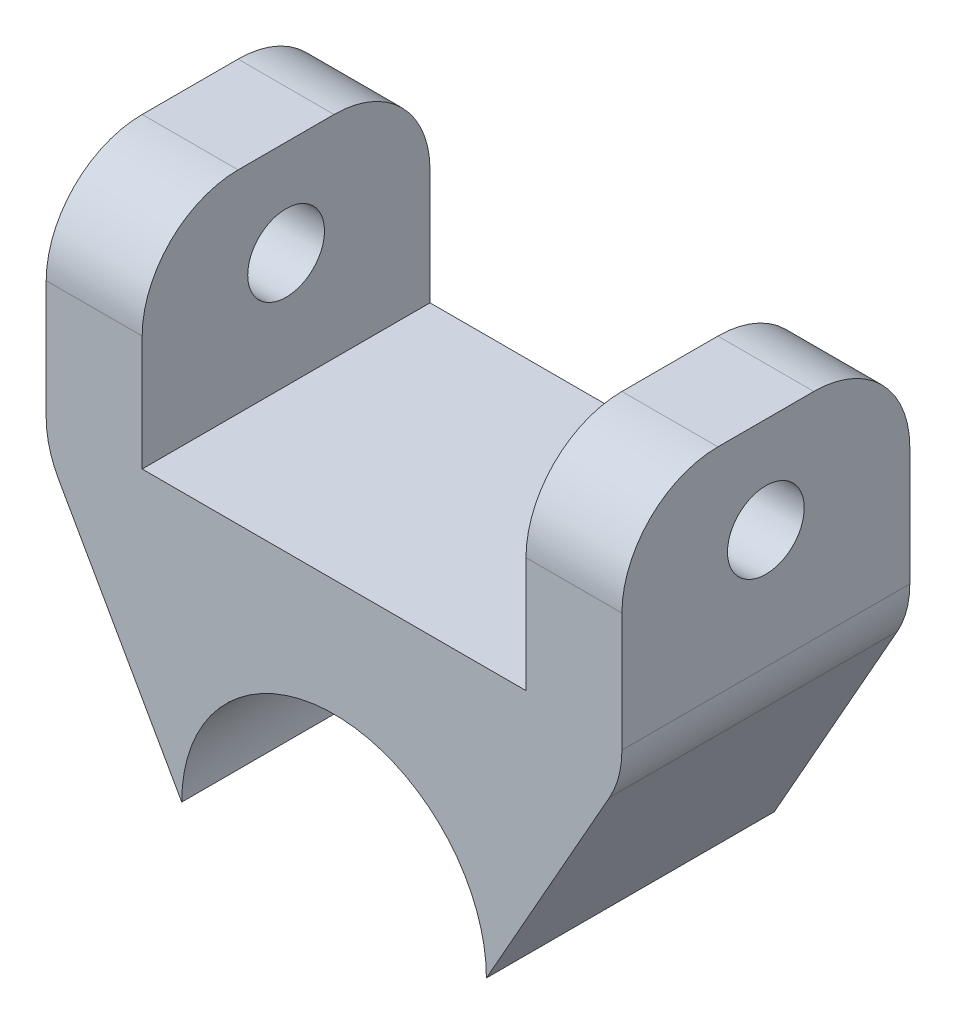
ISO-10303-21;
HEADER;
FILE_DESCRIPTION(('STEP AP214'),'2;1');
FILE_NAME('part.step','',(''),(''),'','','');
FILE_SCHEMA(('AUTOMOTIVE_DESIGN { 1 0 10303 214 1 1 1 1 }'));
ENDSEC;
DATA;
#1=APPLICATION_CONTEXT('core data for automotive mechanical design processes');
#2=APPLICATION_PROTOCOL_DEFINITION('international standard','automotive_design',2000,#1);
#3=PRODUCT_CONTEXT('',#1,'mechanical');
#4=PRODUCT('Part','Part','',(#3));
#5=PRODUCT_RELATED_PRODUCT_CATEGORY('part','',(#4));
#6=PRODUCT_DEFINITION_FORMATION('','',#4);
#7=PRODUCT_DEFINITION_CONTEXT('part definition',#1,'design');
#8=PRODUCT_DEFINITION('design','',#6,#7);
#9=PRODUCT_DEFINITION_SHAPE('','',#8);
#10=(LENGTH_UNIT() NAMED_UNIT(*) SI_UNIT(.MILLI.,.METRE.));
#11=(NAMED_UNIT(*) PLANE_ANGLE_UNIT() SI_UNIT($,.RADIAN.));
#12=(NAMED_UNIT(*) SI_UNIT($,.STERADIAN.) SOLID_ANGLE_UNIT());
#13=UNCERTAINTY_MEASURE_WITH_UNIT(LENGTH_MEASURE(1.E-05),#10,'distance_accuracy_value','');
#14=(GEOMETRIC_REPRESENTATION_CONTEXT(3) GLOBAL_UNCERTAINTY_ASSIGNED_CONTEXT((#13)) GLOBAL_UNIT_ASSIGNED_CONTEXT((#10,
#11,#12)) REPRESENTATION_CONTEXT('',''));
#15=CARTESIAN_POINT('',(0.,0.,0.));
#16=DIRECTION('',(0.,0.,1.));
#17=DIRECTION('',(1.,0.,0.));
#18=AXIS2_PLACEMENT_3D('',#15,#16,#17);
#19=CARTESIAN_POINT('',(-22.7406242301351,-12.8484526900263,30.));
#20=DIRECTION('',(0.870643904056745,0.491913805792061,0.));
#21=DIRECTION('',(-0.491913805792061,0.870643904056745,0.));
#22=AXIS2_PLACEMENT_3D('',#19,#20,#21);
#23=PLANE('',#22);
#24=DIRECTION('',(0.491913805792061,-0.870643904056745,0.));
#25=VECTOR('',#24,1.);
#26=CARTESIAN_POINT('',(-22.7406242301351,-12.8484526900263,30.));
#27=LINE('',#26,#25);
#28=CARTESIAN_POINT('',(-28.7064390405674,-2.28948842377443,30.));
#29=VERTEX_POINT('',#28);
#30=CARTESIAN_POINT('',(-15.875,-25.,30.));
#31=VERTEX_POINT('',#30);
#32=EDGE_CURVE('E204',#29,#31,#27,.T.);
#33=ORIENTED_EDGE('',*,*,#32,.F.);
#34=DIRECTION('',(0.,0.,-1.));
#35=VECTOR('',#34,1.);
#36=CARTESIAN_POINT('',(-28.7064390405674,-2.28948842377443,0.));
#37=LINE('',#36,#35);
#38=CARTESIAN_POINT('',(-28.7064390405674,-2.28948842377443,0.));
#39=VERTEX_POINT('',#38);
#40=EDGE_CURVE('E43',#29,#39,#37,.T.);
#41=ORIENTED_EDGE('',*,*,#40,.T.);
#42=DIRECTION('',(0.491913805792061,-0.870643904056745,0.));
#43=VECTOR('',#42,1.);
#44=CARTESIAN_POINT('',(-22.7406242301351,-12.8484526900263,0.));
#45=LINE('',#44,#43);
#46=CARTESIAN_POINT('',(-15.875,-25.,0.));
#47=VERTEX_POINT('',#46);
#48=EDGE_CURVE('E201',#39,#47,#45,.T.);
#49=ORIENTED_EDGE('',*,*,#48,.T.);
#50=DIRECTION('',(0.,0.,-1.));
#51=VECTOR('',#50,1.);
#52=CARTESIAN_POINT('',(-15.875,-25.,30.));
#53=LINE('',#52,#51);
#54=EDGE_CURVE('E234',#31,#47,#53,.T.);
#55=ORIENTED_EDGE('',*,*,#54,.F.);
#56=EDGE_LOOP('',(#33,#41,#49,#55));
#57=FACE_BOUND('',#56,.T.);
#58=ADVANCED_FACE('F35',(#57),#23,.F.);
#59=CARTESIAN_POINT('',(0.,-25.,30.));
#60=DIRECTION('',(0.,0.,-1.));
#61=DIRECTION('',(-1.,0.,0.));
#62=AXIS2_PLACEMENT_3D('',#59,#60,#61);
#63=CYLINDRICAL_SURFACE('',#62,15.875);
#64=CARTESIAN_POINT('',(0.,-25.,0.));
#65=DIRECTION('',(0.,0.,1.));
#66=DIRECTION('',(1.,0.,0.));
#67=AXIS2_PLACEMENT_3D('',#64,#65,#66);
#68=CIRCLE('',#67,15.875);
#69=CARTESIAN_POINT('',(15.875,-25.,0.));
#70=VERTEX_POINT('',#69);
#71=EDGE_CURVE('E218',#47,#70,#68,.F.);
#72=ORIENTED_EDGE('',*,*,#71,.T.);
#73=DIRECTION('',(0.,0.,-1.));
#74=VECTOR('',#73,1.);
#75=CARTESIAN_POINT('',(15.875,-25.,30.));
#76=LINE('',#75,#74);
#77=CARTESIAN_POINT('',(15.875,-25.,30.));
#78=VERTEX_POINT('',#77);
#79=EDGE_CURVE('E231',#78,#70,#76,.T.);
#80=ORIENTED_EDGE('',*,*,#79,.F.);
#81=CARTESIAN_POINT('',(0.,-25.,30.));
#82=DIRECTION('',(0.,0.,1.));
#83=DIRECTION('',(1.,0.,0.));
#84=AXIS2_PLACEMENT_3D('',#81,#82,#83);
#85=CIRCLE('',#84,15.875);
#86=EDGE_CURVE('E206',#31,#78,#85,.F.);
#87=ORIENTED_EDGE('',*,*,#86,.F.);
#88=ORIENTED_EDGE('',*,*,#54,.T.);
#89=EDGE_LOOP('',(#72,#80,#87,#88));
#90=FACE_BOUND('',#89,.T.);
#91=ADVANCED_FACE('F293',(#90),#63,.F.);
#92=CARTESIAN_POINT('',(22.7406242301351,-12.8484526900263,30.));
#93=DIRECTION('',(-0.870643904056745,0.491913805792061,0.));
#94=DIRECTION('',(-0.491913805792061,-0.870643904056745,0.));
#95=AXIS2_PLACEMENT_3D('',#92,#93,#94);
#96=PLANE('',#95);
#97=DIRECTION('',(0.491913805792061,0.870643904056745,0.));
#98=VECTOR('',#97,1.);
#99=CARTESIAN_POINT('',(22.7406242301351,-12.8484526900263,0.));
#100=LINE('',#99,#98);
#101=CARTESIAN_POINT('',(28.7064390405675,-2.28948842377443,0.));
#102=VERTEX_POINT('',#101);
#103=EDGE_CURVE('E220',#70,#102,#100,.T.);
#104=ORIENTED_EDGE('',*,*,#103,.T.);
#105=DIRECTION('',(0.,0.,-1.));
#106=VECTOR('',#105,1.);
#107=CARTESIAN_POINT('',(28.7064390405675,-2.28948842377444,30.));
#108=LINE('',#107,#106);
#109=CARTESIAN_POINT('',(28.7064390405675,-2.28948842377443,30.));
#110=VERTEX_POINT('',#109);
#111=EDGE_CURVE('E278',#102,#110,#108,.F.);
#112=ORIENTED_EDGE('',*,*,#111,.T.);
#113=DIRECTION('',(0.491913805792061,0.870643904056745,0.));
#114=VECTOR('',#113,1.);
#115=CARTESIAN_POINT('',(22.7406242301351,-12.8484526900263,30.));
#116=LINE('',#115,#114);
#117=EDGE_CURVE('E209',#78,#110,#116,.T.);
#118=ORIENTED_EDGE('',*,*,#117,.F.);
#119=ORIENTED_EDGE('',*,*,#79,.T.);
#120=EDGE_LOOP('',(#104,#112,#118,#119));
#121=FACE_BOUND('',#120,.T.);
#122=ADVANCED_FACE('F336',(#121),#96,.F.);
#123=CARTESIAN_POINT('',(30.,0.,30.));
#124=DIRECTION('',(-1.,0.,0.));
#125=DIRECTION('',(0.,0.,1.));
#126=AXIS2_PLACEMENT_3D('',#123,#124,#125);
#127=PLANE('',#126);
#128=CARTESIAN_POINT('',(30.,15.,15.));
#129=DIRECTION('',(-1.,0.,0.));
#130=DIRECTION('',(0.,0.,1.));
#131=AXIS2_PLACEMENT_3D('',#128,#129,#130);
#132=CIRCLE('',#131,4.);
#133=CARTESIAN_POINT('',(30.,15.,19.));
#134=VERTEX_POINT('',#133);
#135=EDGE_CURVE('E198',#134,#134,#132,.T.);
#136=ORIENTED_EDGE('',*,*,#135,.T.);
#137=EDGE_LOOP('',(#136));
#138=FACE_BOUND('',#137,.T.);
#139=DIRECTION('',(0.,1.,0.));
#140=VECTOR('',#139,1.);
#141=CARTESIAN_POINT('',(30.,0.,30.));
#142=LINE('',#141,#140);
#143=CARTESIAN_POINT('',(30.,2.62964963414617,30.));
#144=VERTEX_POINT('',#143);
#145=CARTESIAN_POINT('',(30.,15.,30.));
#146=VERTEX_POINT('',#145);
#147=EDGE_CURVE('E212',#144,#146,#142,.T.);
#148=ORIENTED_EDGE('',*,*,#147,.F.);
#149=DIRECTION('',(0.,0.,-1.));
#150=VECTOR('',#149,1.);
#151=CARTESIAN_POINT('',(30.,2.62964963414617,30.));
#152=LINE('',#151,#150);
#153=CARTESIAN_POINT('',(30.,2.62964963414617,0.));
#154=VERTEX_POINT('',#153);
#155=EDGE_CURVE('E267',#144,#154,#152,.T.);
#156=ORIENTED_EDGE('',*,*,#155,.T.);
#157=DIRECTION('',(0.,1.,0.));
#158=VECTOR('',#157,1.);
#159=CARTESIAN_POINT('',(30.,0.,0.));
#160=LINE('',#159,#158);
#161=CARTESIAN_POINT('',(30.,15.,0.));
#162=VERTEX_POINT('',#161);
#163=EDGE_CURVE('E223',#154,#162,#160,.T.);
#164=ORIENTED_EDGE('',*,*,#163,.T.);
#165=CARTESIAN_POINT('',(30.,15.,10.));
#166=DIRECTION('',(-1.,0.,0.));
#167=DIRECTION('',(0.,0.,1.));
#168=AXIS2_PLACEMENT_3D('',#165,#166,#167);
#169=CIRCLE('',#168,10.);
#170=CARTESIAN_POINT('',(30.,25.,10.));
#171=VERTEX_POINT('',#170);
#172=EDGE_CURVE('E244',#162,#171,#169,.F.);
#173=ORIENTED_EDGE('',*,*,#172,.T.);
#174=DIRECTION('',(0.,0.,-1.));
#175=VECTOR('',#174,1.);
#176=CARTESIAN_POINT('',(30.,25.,30.));
#177=LINE('',#176,#175);
#178=CARTESIAN_POINT('',(30.,25.,20.));
#179=VERTEX_POINT('',#178);
#180=EDGE_CURVE('E228',#179,#171,#177,.T.);
#181=ORIENTED_EDGE('',*,*,#180,.F.);
#182=CARTESIAN_POINT('',(30.,15.,20.));
#183=DIRECTION('',(-1.,0.,0.));
#184=DIRECTION('',(0.,0.,1.));
#185=AXIS2_PLACEMENT_3D('',#182,#183,#184);
#186=CIRCLE('',#185,10.);
#187=EDGE_CURVE('E241',#179,#146,#186,.F.);
#188=ORIENTED_EDGE('',*,*,#187,.T.);
#189=EDGE_LOOP('',(#148,#156,#164,#173,#181,#188));
#190=FACE_BOUND('',#189,.T.);
#191=ADVANCED_FACE('F304',(#138,#190),#127,.F.);
#192=CARTESIAN_POINT('',(0.,25.,30.));
#193=DIRECTION('',(0.,1.,0.));
#194=DIRECTION('',(-1.,0.,0.));
#195=AXIS2_PLACEMENT_3D('',#192,#193,#194);
#196=PLANE('',#195);
#197=DIRECTION('',(0.,0.,1.));
#198=VECTOR('',#197,1.);
#199=CARTESIAN_POINT('',(20.,25.,0.));
#200=LINE('',#199,#198);
#201=CARTESIAN_POINT('',(20.,25.,10.));
#202=VERTEX_POINT('',#201);
#203=CARTESIAN_POINT('',(20.,25.,20.));
#204=VERTEX_POINT('',#203);
#205=EDGE_CURVE('E184',#202,#204,#200,.T.);
#206=ORIENTED_EDGE('',*,*,#205,.T.);
#207=DIRECTION('',(1.,0.,0.));
#208=VECTOR('',#207,1.);
#209=CARTESIAN_POINT('',(0.,25.,20.));
#210=LINE('',#209,#208);
#211=EDGE_CURVE('E246',#204,#179,#210,.T.);
#212=ORIENTED_EDGE('',*,*,#211,.T.);
#213=ORIENTED_EDGE('',*,*,#180,.T.);
#214=DIRECTION('',(1.,0.,0.));
#215=VECTOR('',#214,1.);
#216=CARTESIAN_POINT('',(15.875,25.,10.));
#217=LINE('',#216,#215);
#218=EDGE_CURVE('E248',#171,#202,#217,.F.);
#219=ORIENTED_EDGE('',*,*,#218,.T.);
#220=EDGE_LOOP('',(#206,#212,#213,#219));
#221=FACE_BOUND('',#220,.T.);
#222=ADVANCED_FACE('F313',(#221),#196,.T.);
#223=CARTESIAN_POINT('',(0.,25.,30.));
#224=DIRECTION('',(0.,1.,0.));
#225=DIRECTION('',(-1.,0.,0.));
#226=AXIS2_PLACEMENT_3D('',#223,#224,#225);
#227=PLANE('',#226);
#228=DIRECTION('',(0.,0.,1.));
#229=VECTOR('',#228,1.);
#230=CARTESIAN_POINT('',(-20.,25.,0.));
#231=LINE('',#230,#229);
#232=CARTESIAN_POINT('',(-20.,25.,10.));
#233=VERTEX_POINT('',#232);
#234=CARTESIAN_POINT('',(-20.,25.,20.));
#235=VERTEX_POINT('',#234);
#236=EDGE_CURVE('E181',#233,#235,#231,.T.);
#237=ORIENTED_EDGE('',*,*,#236,.F.);
#238=DIRECTION('',(1.,0.,0.));
#239=VECTOR('',#238,1.);
#240=CARTESIAN_POINT('',(-30.,25.,10.));
#241=LINE('',#240,#239);
#242=CARTESIAN_POINT('',(-30.,25.,10.));
#243=VERTEX_POINT('',#242);
#244=EDGE_CURVE('E260',#233,#243,#241,.F.);
#245=ORIENTED_EDGE('',*,*,#244,.T.);
#246=DIRECTION('',(0.,0.,-1.));
#247=VECTOR('',#246,1.);
#248=CARTESIAN_POINT('',(-30.,25.,30.));
#249=LINE('',#248,#247);
#250=CARTESIAN_POINT('',(-30.,25.,20.));
#251=VERTEX_POINT('',#250);
#252=EDGE_CURVE('E216',#251,#243,#249,.T.);
#253=ORIENTED_EDGE('',*,*,#252,.F.);
#254=DIRECTION('',(1.,0.,0.));
#255=VECTOR('',#254,1.);
#256=CARTESIAN_POINT('',(0.,25.,20.));
#257=LINE('',#256,#255);
#258=EDGE_CURVE('E257',#251,#235,#257,.T.);
#259=ORIENTED_EDGE('',*,*,#258,.T.);
#260=EDGE_LOOP('',(#237,#245,#253,#259));
#261=FACE_BOUND('',#260,.T.);
#262=ADVANCED_FACE('F342',(#261),#227,.T.);
#263=CARTESIAN_POINT('',(-30.,0.,30.));
#264=DIRECTION('',(-1.,0.,0.));
#265=DIRECTION('',(0.,0.,1.));
#266=AXIS2_PLACEMENT_3D('',#263,#264,#265);
#267=PLANE('',#266);
#268=CARTESIAN_POINT('',(-30.,15.,15.));
#269=DIRECTION('',(-1.,0.,0.));
#270=DIRECTION('',(0.,0.,1.));
#271=AXIS2_PLACEMENT_3D('',#268,#269,#270);
#272=CIRCLE('',#271,4.);
#273=CARTESIAN_POINT('',(-30.,15.,19.));
#274=VERTEX_POINT('',#273);
#275=EDGE_CURVE('E197',#274,#274,#272,.T.);
#276=ORIENTED_EDGE('',*,*,#275,.F.);
#277=EDGE_LOOP('',(#276));
#278=FACE_BOUND('',#277,.T.);
#279=DIRECTION('',(0.,1.,0.));
#280=VECTOR('',#279,1.);
#281=CARTESIAN_POINT('',(-30.,0.,0.));
#282=LINE('',#281,#280);
#283=CARTESIAN_POINT('',(-30.,2.62964963414618,0.));
#284=VERTEX_POINT('',#283);
#285=CARTESIAN_POINT('',(-30.,15.,0.));
#286=VERTEX_POINT('',#285);
#287=EDGE_CURVE('E207',#284,#286,#282,.T.);
#288=ORIENTED_EDGE('',*,*,#287,.F.);
#289=DIRECTION('',(0.,0.,-1.));
#290=VECTOR('',#289,1.);
#291=CARTESIAN_POINT('',(-30.,2.62964963414618,30.));
#292=LINE('',#291,#290);
#293=CARTESIAN_POINT('',(-30.,2.62964963414618,30.));
#294=VERTEX_POINT('',#293);
#295=EDGE_CURVE('E11',#284,#294,#292,.F.);
#296=ORIENTED_EDGE('',*,*,#295,.T.);
#297=DIRECTION('',(0.,1.,0.));
#298=VECTOR('',#297,1.);
#299=CARTESIAN_POINT('',(-30.,0.,30.));
#300=LINE('',#299,#298);
#301=CARTESIAN_POINT('',(-30.,15.,30.));
#302=VERTEX_POINT('',#301);
#303=EDGE_CURVE('E214',#294,#302,#300,.T.);
#304=ORIENTED_EDGE('',*,*,#303,.T.);
#305=CARTESIAN_POINT('',(-30.,15.,20.));
#306=DIRECTION('',(-1.,0.,0.));
#307=DIRECTION('',(0.,0.,1.));
#308=AXIS2_PLACEMENT_3D('',#305,#306,#307);
#309=CIRCLE('',#308,10.);
#310=EDGE_CURVE('E262',#302,#251,#309,.T.);
#311=ORIENTED_EDGE('',*,*,#310,.T.);
#312=ORIENTED_EDGE('',*,*,#252,.T.);
#313=CARTESIAN_POINT('',(-30.,15.,10.));
#314=DIRECTION('',(-1.,0.,0.));
#315=DIRECTION('',(0.,0.,1.));
#316=AXIS2_PLACEMENT_3D('',#313,#314,#315);
#317=CIRCLE('',#316,10.);
#318=EDGE_CURVE('E264',#243,#286,#317,.T.);
#319=ORIENTED_EDGE('',*,*,#318,.T.);
#320=EDGE_LOOP('',(#288,#296,#304,#311,#312,#319));
#321=FACE_BOUND('',#320,.T.);
#322=ADVANCED_FACE('F378',(#278,#321),#267,.T.);
#323=CARTESIAN_POINT('',(0.,0.,30.));
#324=DIRECTION('',(0.,0.,1.));
#325=DIRECTION('',(1.,0.,0.));
#326=AXIS2_PLACEMENT_3D('',#323,#324,#325);
#327=PLANE('',#326);
#328=ORIENTED_EDGE('',*,*,#117,.T.);
#329=CARTESIAN_POINT('',(20.,2.62964963414617,30.));
#330=DIRECTION('',(0.,0.,1.));
#331=DIRECTION('',(1.,0.,0.));
#332=AXIS2_PLACEMENT_3D('',#329,#330,#331);
#333=CIRCLE('',#332,10.);
#334=EDGE_CURVE('E281',#110,#144,#333,.T.);
#335=ORIENTED_EDGE('',*,*,#334,.T.);
#336=ORIENTED_EDGE('',*,*,#147,.T.);
#337=DIRECTION('',(1.,0.,0.));
#338=VECTOR('',#337,1.);
#339=CARTESIAN_POINT('',(0.,15.,30.));
#340=LINE('',#339,#338);
#341=CARTESIAN_POINT('',(20.,15.,30.));
#342=VERTEX_POINT('',#341);
#343=EDGE_CURVE('E254',#146,#342,#340,.F.);
#344=ORIENTED_EDGE('',*,*,#343,.T.);
#345=DIRECTION('',(0.,1.,0.));
#346=VECTOR('',#345,1.);
#347=CARTESIAN_POINT('',(20.,3.,30.));
#348=LINE('',#347,#346);
#349=CARTESIAN_POINT('',(20.,3.,30.));
#350=VERTEX_POINT('',#349);
#351=EDGE_CURVE('E173',#350,#342,#348,.T.);
#352=ORIENTED_EDGE('',*,*,#351,.F.);
#353=DIRECTION('',(1.,0.,0.));
#354=VECTOR('',#353,1.);
#355=CARTESIAN_POINT('',(-20.,3.,30.));
#356=LINE('',#355,#354);
#357=CARTESIAN_POINT('',(-20.,3.,30.));
#358=VERTEX_POINT('',#357);
#359=EDGE_CURVE('E175',#358,#350,#356,.T.);
#360=ORIENTED_EDGE('',*,*,#359,.F.);
#361=DIRECTION('',(0.,-1.,0.));
#362=VECTOR('',#361,1.);
#363=CARTESIAN_POINT('',(-20.,3.,30.));
#364=LINE('',#363,#362);
#365=CARTESIAN_POINT('',(-20.,15.,30.));
#366=VERTEX_POINT('',#365);
#367=EDGE_CURVE('E154',#366,#358,#364,.T.);
#368=ORIENTED_EDGE('',*,*,#367,.F.);
#369=DIRECTION('',(1.,0.,0.));
#370=VECTOR('',#369,1.);
#371=CARTESIAN_POINT('',(0.,15.,30.));
#372=LINE('',#371,#370);
#373=EDGE_CURVE('E251',#366,#302,#372,.F.);
#374=ORIENTED_EDGE('',*,*,#373,.T.);
#375=ORIENTED_EDGE('',*,*,#303,.F.);
#376=CARTESIAN_POINT('',(-20.,2.62964963414618,30.));
#377=DIRECTION('',(0.,0.,1.));
#378=DIRECTION('',(1.,0.,0.));
#379=AXIS2_PLACEMENT_3D('',#376,#377,#378);
#380=CIRCLE('',#379,10.);
#381=EDGE_CURVE('E50',#294,#29,#380,.T.);
#382=ORIENTED_EDGE('',*,*,#381,.T.);
#383=ORIENTED_EDGE('',*,*,#32,.T.);
#384=ORIENTED_EDGE('',*,*,#86,.T.);
#385=EDGE_LOOP('',(#328,#335,#336,#344,#352,#360,#368,#374,#375,#382,#383,#384));
#386=FACE_BOUND('',#385,.T.);
#387=ADVANCED_FACE('F295',(#386),#327,.T.);
#388=CARTESIAN_POINT('',(0.,0.,0.));
#389=DIRECTION('',(0.,0.,1.));
#390=DIRECTION('',(1.,0.,0.));
#391=AXIS2_PLACEMENT_3D('',#388,#389,#390);
#392=PLANE('',#391);
#393=ORIENTED_EDGE('',*,*,#163,.F.);
#394=CARTESIAN_POINT('',(20.,2.62964963414617,0.));
#395=DIRECTION('',(0.,0.,1.));
#396=DIRECTION('',(1.,0.,0.));
#397=AXIS2_PLACEMENT_3D('',#394,#395,#396);
#398=CIRCLE('',#397,10.);
#399=EDGE_CURVE('E276',#154,#102,#398,.F.);
#400=ORIENTED_EDGE('',*,*,#399,.T.);
#401=ORIENTED_EDGE('',*,*,#103,.F.);
#402=ORIENTED_EDGE('',*,*,#71,.F.);
#403=ORIENTED_EDGE('',*,*,#48,.F.);
#404=CARTESIAN_POINT('',(-20.,2.62964963414618,0.));
#405=DIRECTION('',(0.,0.,1.));
#406=DIRECTION('',(1.,0.,0.));
#407=AXIS2_PLACEMENT_3D('',#404,#405,#406);
#408=CIRCLE('',#407,10.);
#409=EDGE_CURVE('E274',#39,#284,#408,.F.);
#410=ORIENTED_EDGE('',*,*,#409,.T.);
#411=ORIENTED_EDGE('',*,*,#287,.T.);
#412=DIRECTION('',(1.,0.,0.));
#413=VECTOR('',#412,1.);
#414=CARTESIAN_POINT('',(-15.875,15.,0.));
#415=LINE('',#414,#413);
#416=CARTESIAN_POINT('',(-20.,15.,0.));
#417=VERTEX_POINT('',#416);
#418=EDGE_CURVE('E172',#286,#417,#415,.T.);
#419=ORIENTED_EDGE('',*,*,#418,.T.);
#420=DIRECTION('',(0.,-1.,0.));
#421=VECTOR('',#420,1.);
#422=CARTESIAN_POINT('',(-20.,3.,0.));
#423=LINE('',#422,#421);
#424=CARTESIAN_POINT('',(-20.,3.,0.));
#425=VERTEX_POINT('',#424);
#426=EDGE_CURVE('E151',#417,#425,#423,.T.);
#427=ORIENTED_EDGE('',*,*,#426,.T.);
#428=DIRECTION('',(1.,0.,0.));
#429=VECTOR('',#428,1.);
#430=CARTESIAN_POINT('',(-20.,3.,0.));
#431=LINE('',#430,#429);
#432=CARTESIAN_POINT('',(20.,3.,0.));
#433=VERTEX_POINT('',#432);
#434=EDGE_CURVE('E162',#425,#433,#431,.T.);
#435=ORIENTED_EDGE('',*,*,#434,.T.);
#436=DIRECTION('',(0.,1.,0.));
#437=VECTOR('',#436,1.);
#438=CARTESIAN_POINT('',(20.,3.,0.));
#439=LINE('',#438,#437);
#440=CARTESIAN_POINT('',(20.,15.,0.));
#441=VERTEX_POINT('',#440);
#442=EDGE_CURVE('E159',#433,#441,#439,.T.);
#443=ORIENTED_EDGE('',*,*,#442,.T.);
#444=DIRECTION('',(1.,0.,0.));
#445=VECTOR('',#444,1.);
#446=CARTESIAN_POINT('',(30.,15.,0.));
#447=LINE('',#446,#445);
#448=EDGE_CURVE('E238',#441,#162,#447,.T.);
#449=ORIENTED_EDGE('',*,*,#448,.T.);
#450=EDGE_LOOP('',(#393,#400,#401,#402,#403,#410,#411,#419,#427,#435,#443,#449));
#451=FACE_BOUND('',#450,.T.);
#452=ADVANCED_FACE('F170',(#451),#392,.F.);
#453=CARTESIAN_POINT('',(0.,15.,10.));
#454=DIRECTION('',(-1.,0.,0.));
#455=DIRECTION('',(0.,-1.,0.));
#456=AXIS2_PLACEMENT_3D('',#453,#454,#455);
#457=CYLINDRICAL_SURFACE('',#456,10.);
#458=CARTESIAN_POINT('',(20.,15.,10.));
#459=DIRECTION('',(1.,0.,0.));
#460=DIRECTION('',(0.,0.,-1.));
#461=AXIS2_PLACEMENT_3D('',#458,#459,#460);
#462=CIRCLE('',#461,10.);
#463=EDGE_CURVE('E190',#202,#441,#462,.F.);
#464=ORIENTED_EDGE('',*,*,#463,.F.);
#465=ORIENTED_EDGE('',*,*,#218,.F.);
#466=ORIENTED_EDGE('',*,*,#172,.F.);
#467=ORIENTED_EDGE('',*,*,#448,.F.);
#468=EDGE_LOOP('',(#464,#465,#466,#467));
#469=FACE_BOUND('',#468,.T.);
#470=ADVANCED_FACE('F310',(#469),#457,.T.);
#471=CARTESIAN_POINT('',(0.,15.,20.));
#472=DIRECTION('',(1.,0.,0.));
#473=DIRECTION('',(0.,1.,0.));
#474=AXIS2_PLACEMENT_3D('',#471,#472,#473);
#475=CYLINDRICAL_SURFACE('',#474,10.);
#476=CARTESIAN_POINT('',(20.,15.,20.));
#477=DIRECTION('',(1.,0.,0.));
#478=DIRECTION('',(0.,0.,-1.));
#479=AXIS2_PLACEMENT_3D('',#476,#477,#478);
#480=CIRCLE('',#479,10.);
#481=EDGE_CURVE('E188',#342,#204,#480,.F.);
#482=ORIENTED_EDGE('',*,*,#481,.F.);
#483=ORIENTED_EDGE('',*,*,#343,.F.);
#484=ORIENTED_EDGE('',*,*,#187,.F.);
#485=ORIENTED_EDGE('',*,*,#211,.F.);
#486=EDGE_LOOP('',(#482,#483,#484,#485));
#487=FACE_BOUND('',#486,.T.);
#488=ADVANCED_FACE('F319',(#487),#475,.T.);
#489=CARTESIAN_POINT('',(0.,15.,10.));
#490=DIRECTION('',(-1.,0.,0.));
#491=DIRECTION('',(0.,-1.,0.));
#492=AXIS2_PLACEMENT_3D('',#489,#490,#491);
#493=CYLINDRICAL_SURFACE('',#492,10.);
#494=CARTESIAN_POINT('',(-20.,15.,10.));
#495=DIRECTION('',(-1.,0.,0.));
#496=DIRECTION('',(0.,0.,1.));
#497=AXIS2_PLACEMENT_3D('',#494,#495,#496);
#498=CIRCLE('',#497,10.);
#499=EDGE_CURVE('E195',#417,#233,#498,.F.);
#500=ORIENTED_EDGE('',*,*,#499,.F.);
#501=ORIENTED_EDGE('',*,*,#418,.F.);
#502=ORIENTED_EDGE('',*,*,#318,.F.);
#503=ORIENTED_EDGE('',*,*,#244,.F.);
#504=EDGE_LOOP('',(#500,#501,#502,#503));
#505=FACE_BOUND('',#504,.T.);
#506=ADVANCED_FACE('F356',(#505),#493,.T.);
#507=CARTESIAN_POINT('',(0.,15.,20.));
#508=DIRECTION('',(1.,0.,0.));
#509=DIRECTION('',(0.,1.,0.));
#510=AXIS2_PLACEMENT_3D('',#507,#508,#509);
#511=CYLINDRICAL_SURFACE('',#510,10.);
#512=CARTESIAN_POINT('',(-20.,15.,20.));
#513=DIRECTION('',(-1.,0.,0.));
#514=DIRECTION('',(0.,0.,1.));
#515=AXIS2_PLACEMENT_3D('',#512,#513,#514);
#516=CIRCLE('',#515,10.);
#517=EDGE_CURVE('E193',#235,#366,#516,.F.);
#518=ORIENTED_EDGE('',*,*,#517,.F.);
#519=ORIENTED_EDGE('',*,*,#258,.F.);
#520=ORIENTED_EDGE('',*,*,#310,.F.);
#521=ORIENTED_EDGE('',*,*,#373,.F.);
#522=EDGE_LOOP('',(#518,#519,#520,#521));
#523=FACE_BOUND('',#522,.T.);
#524=ADVANCED_FACE('F359',(#523),#511,.T.);
#525=CARTESIAN_POINT('',(30.,15.,15.));
#526=DIRECTION('',(-1.,0.,0.));
#527=DIRECTION('',(0.,0.,1.));
#528=AXIS2_PLACEMENT_3D('',#525,#526,#527);
#529=CYLINDRICAL_SURFACE('',#528,4.);
#530=CARTESIAN_POINT('',(-20.,15.,15.));
#531=DIRECTION('',(-1.,0.,0.));
#532=DIRECTION('',(0.,0.,1.));
#533=AXIS2_PLACEMENT_3D('',#530,#531,#532);
#534=CIRCLE('',#533,4.);
#535=CARTESIAN_POINT('',(-20.,15.,19.));
#536=VERTEX_POINT('',#535);
#537=EDGE_CURVE('E192',#536,#536,#534,.F.);
#538=ORIENTED_EDGE('',*,*,#537,.T.);
#539=EDGE_LOOP('',(#538));
#540=FACE_BOUND('',#539,.T.);
#541=ORIENTED_EDGE('',*,*,#275,.T.);
#542=EDGE_LOOP('',(#541));
#543=FACE_BOUND('',#542,.T.);
#544=ADVANCED_FACE('F331',(#540,#543),#529,.F.);
#545=CARTESIAN_POINT('',(20.,15.,15.));
#546=DIRECTION('',(1.,0.,0.));
#547=DIRECTION('',(0.,0.,-1.));
#548=AXIS2_PLACEMENT_3D('',#545,#546,#547);
#549=CIRCLE('',#548,4.);
#550=CARTESIAN_POINT('',(20.,15.,11.));
#551=VERTEX_POINT('',#550);
#552=EDGE_CURVE('E183',#551,#551,#549,.F.);
#553=ORIENTED_EDGE('',*,*,#552,.T.);
#554=EDGE_LOOP('',(#553));
#555=FACE_BOUND('',#554,.T.);
#556=ORIENTED_EDGE('',*,*,#135,.F.);
#557=EDGE_LOOP('',(#556));
#558=FACE_BOUND('',#557,.T.);
#559=ADVANCED_FACE('F328',(#555,#558),#529,.F.);
#560=CARTESIAN_POINT('',(-20.,3.,0.));
#561=DIRECTION('',(-1.,0.,0.));
#562=DIRECTION('',(0.,0.,1.));
#563=AXIS2_PLACEMENT_3D('',#560,#561,#562);
#564=PLANE('',#563);
#565=ORIENTED_EDGE('',*,*,#499,.T.);
#566=ORIENTED_EDGE('',*,*,#236,.T.);
#567=ORIENTED_EDGE('',*,*,#517,.T.);
#568=ORIENTED_EDGE('',*,*,#367,.T.);
#569=DIRECTION('',(0.,0.,1.));
#570=VECTOR('',#569,1.);
#571=CARTESIAN_POINT('',(-20.,3.,0.));
#572=LINE('',#571,#570);
#573=EDGE_CURVE('E146',#425,#358,#572,.T.);
#574=ORIENTED_EDGE('',*,*,#573,.F.);
#575=ORIENTED_EDGE('',*,*,#426,.F.);
#576=EDGE_LOOP('',(#565,#566,#567,#568,#574,#575));
#577=FACE_BOUND('',#576,.T.);
#578=ORIENTED_EDGE('',*,*,#537,.F.);
#579=EDGE_LOOP('',(#578));
#580=FACE_BOUND('',#579,.T.);
#581=ADVANCED_FACE('F148',(#577,#580),#564,.F.);
#582=CARTESIAN_POINT('',(20.,3.,0.));
#583=DIRECTION('',(1.,0.,0.));
#584=DIRECTION('',(0.,0.,-1.));
#585=AXIS2_PLACEMENT_3D('',#582,#583,#584);
#586=PLANE('',#585);
#587=ORIENTED_EDGE('',*,*,#463,.T.);
#588=ORIENTED_EDGE('',*,*,#442,.F.);
#589=DIRECTION('',(0.,0.,1.));
#590=VECTOR('',#589,1.);
#591=CARTESIAN_POINT('',(20.,3.,0.));
#592=LINE('',#591,#590);
#593=EDGE_CURVE('E158',#433,#350,#592,.T.);
#594=ORIENTED_EDGE('',*,*,#593,.T.);
#595=ORIENTED_EDGE('',*,*,#351,.T.);
#596=ORIENTED_EDGE('',*,*,#481,.T.);
#597=ORIENTED_EDGE('',*,*,#205,.F.);
#598=EDGE_LOOP('',(#587,#588,#594,#595,#596,#597));
#599=FACE_BOUND('',#598,.T.);
#600=ORIENTED_EDGE('',*,*,#552,.F.);
#601=EDGE_LOOP('',(#600));
#602=FACE_BOUND('',#601,.T.);
#603=ADVANCED_FACE('F322',(#599,#602),#586,.F.);
#604=CARTESIAN_POINT('',(-20.,3.,0.));
#605=DIRECTION('',(0.,-1.,0.));
#606=DIRECTION('',(0.,0.,-1.));
#607=AXIS2_PLACEMENT_3D('',#604,#605,#606);
#608=PLANE('',#607);
#609=ORIENTED_EDGE('',*,*,#359,.T.);
#610=ORIENTED_EDGE('',*,*,#593,.F.);
#611=ORIENTED_EDGE('',*,*,#434,.F.);
#612=ORIENTED_EDGE('',*,*,#573,.T.);
#613=EDGE_LOOP('',(#609,#610,#611,#612));
#614=FACE_BOUND('',#613,.T.);
#615=ADVANCED_FACE('F163',(#614),#608,.F.);
#616=CARTESIAN_POINT('',(20.,2.62964963414617,30.));
#617=DIRECTION('',(0.,0.,-1.));
#618=DIRECTION('',(-1.,0.,0.));
#619=AXIS2_PLACEMENT_3D('',#616,#617,#618);
#620=CYLINDRICAL_SURFACE('',#619,10.);
#621=ORIENTED_EDGE('',*,*,#334,.F.);
#622=ORIENTED_EDGE('',*,*,#111,.F.);
#623=ORIENTED_EDGE('',*,*,#399,.F.);
#624=ORIENTED_EDGE('',*,*,#155,.F.);
#625=EDGE_LOOP('',(#621,#622,#623,#624));
#626=FACE_BOUND('',#625,.T.);
#627=ADVANCED_FACE('F302',(#626),#620,.T.);
#628=CARTESIAN_POINT('',(-20.,2.62964963414618,30.));
#629=DIRECTION('',(0.,0.,1.));
#630=DIRECTION('',(1.,0.,0.));
#631=AXIS2_PLACEMENT_3D('',#628,#629,#630);
#632=CYLINDRICAL_SURFACE('',#631,10.);
#633=ORIENTED_EDGE('',*,*,#381,.F.);
#634=ORIENTED_EDGE('',*,*,#295,.F.);
#635=ORIENTED_EDGE('',*,*,#409,.F.);
#636=ORIENTED_EDGE('',*,*,#40,.F.);
#637=EDGE_LOOP('',(#633,#634,#635,#636));
#638=FACE_BOUND('',#637,.T.);
#639=ADVANCED_FACE('F37',(#638),#632,.T.);
#640=CLOSED_SHELL('',(#58,#91,#122,#191,#222,#262,#322,#387,#452,#470,#488,#506,#524,#544,#559,
#581,#603,#615,#627,#639));
#641=MANIFOLD_SOLID_BREP('B2',#640);
#642=ADVANCED_BREP_SHAPE_REPRESENTATION('',(#18,#641),#14);
#643=SHAPE_DEFINITION_REPRESENTATION(#9,#642);
ENDSEC;
END-ISO-10303-21;
